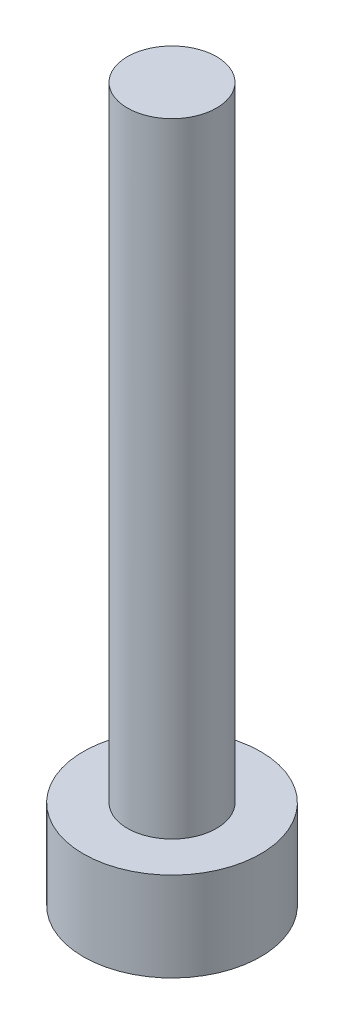
ISO-10303-21;
HEADER;
FILE_DESCRIPTION(('STEP AP214'),'2;1');
FILE_NAME('part.step','',(''),(''),'','','');
FILE_SCHEMA(('AUTOMOTIVE_DESIGN { 1 0 10303 214 1 1 1 1 }'));
ENDSEC;
DATA;
#1=APPLICATION_CONTEXT('core data for automotive mechanical design processes');
#2=APPLICATION_PROTOCOL_DEFINITION('international standard','automotive_design',2000,#1);
#3=PRODUCT_CONTEXT('',#1,'mechanical');
#4=PRODUCT('Part','Part','',(#3));
#5=PRODUCT_RELATED_PRODUCT_CATEGORY('part','',(#4));
#6=PRODUCT_DEFINITION_FORMATION('','',#4);
#7=PRODUCT_DEFINITION_CONTEXT('part definition',#1,'design');
#8=PRODUCT_DEFINITION('design','',#6,#7);
#9=PRODUCT_DEFINITION_SHAPE('','',#8);
#10=(LENGTH_UNIT() NAMED_UNIT(*) SI_UNIT(.MILLI.,.METRE.));
#11=(NAMED_UNIT(*) PLANE_ANGLE_UNIT() SI_UNIT($,.RADIAN.));
#12=(NAMED_UNIT(*) SI_UNIT($,.STERADIAN.) SOLID_ANGLE_UNIT());
#13=UNCERTAINTY_MEASURE_WITH_UNIT(LENGTH_MEASURE(1.E-05),#10,'distance_accuracy_value','');
#14=(GEOMETRIC_REPRESENTATION_CONTEXT(3) GLOBAL_UNCERTAINTY_ASSIGNED_CONTEXT((#13)) GLOBAL_UNIT_ASSIGNED_CONTEXT((#10,
#11,#12)) REPRESENTATION_CONTEXT('',''));
#15=CARTESIAN_POINT('',(0.,0.,0.));
#16=DIRECTION('',(0.,0.,1.));
#17=DIRECTION('',(1.,0.,0.));
#18=AXIS2_PLACEMENT_3D('',#15,#16,#17);
#19=CARTESIAN_POINT('',(0.,14.,0.));
#20=DIRECTION('',(0.,-1.,0.));
#21=DIRECTION('',(0.,0.,-1.));
#22=AXIS2_PLACEMENT_3D('',#19,#20,#21);
#23=CYLINDRICAL_SURFACE('',#22,1.);
#24=CARTESIAN_POINT('',(0.,14.,0.));
#25=DIRECTION('',(0.,1.,0.));
#26=DIRECTION('',(0.,0.,1.));
#27=AXIS2_PLACEMENT_3D('',#24,#25,#26);
#28=CIRCLE('',#27,1.);
#29=CARTESIAN_POINT('',(0.,14.,1.));
#30=VERTEX_POINT('',#29);
#31=EDGE_CURVE('E10',#30,#30,#28,.T.);
#32=ORIENTED_EDGE('',*,*,#31,.F.);
#33=EDGE_LOOP('',(#32));
#34=FACE_BOUND('',#33,.T.);
#35=CARTESIAN_POINT('',(0.,0.,0.));
#36=DIRECTION('',(0.,-1.,0.));
#37=DIRECTION('',(0.,0.,-1.));
#38=AXIS2_PLACEMENT_3D('',#35,#36,#37);
#39=CIRCLE('',#38,1.);
#40=CARTESIAN_POINT('',(0.,0.,-1.));
#41=VERTEX_POINT('',#40);
#42=EDGE_CURVE('E39',#41,#41,#39,.T.);
#43=ORIENTED_EDGE('',*,*,#42,.F.);
#44=EDGE_LOOP('',(#43));
#45=FACE_BOUND('',#44,.T.);
#46=ADVANCED_FACE('F33',(#34,#45),#23,.T.);
#47=CARTESIAN_POINT('',(0.,14.,0.));
#48=DIRECTION('',(0.,1.,0.));
#49=DIRECTION('',(0.,0.,1.));
#50=AXIS2_PLACEMENT_3D('',#47,#48,#49);
#51=PLANE('',#50);
#52=ORIENTED_EDGE('',*,*,#31,.T.);
#53=EDGE_LOOP('',(#52));
#54=FACE_BOUND('',#53,.T.);
#55=ADVANCED_FACE('F66',(#54),#51,.T.);
#56=CARTESIAN_POINT('',(0.,-2.,0.));
#57=DIRECTION('',(0.,1.,0.));
#58=DIRECTION('',(0.,0.,1.));
#59=AXIS2_PLACEMENT_3D('',#56,#57,#58);
#60=CYLINDRICAL_SURFACE('',#59,1.99);
#61=CARTESIAN_POINT('',(0.,-2.,0.));
#62=DIRECTION('',(0.,-1.,0.));
#63=DIRECTION('',(0.,0.,-1.));
#64=AXIS2_PLACEMENT_3D('',#61,#62,#63);
#65=CIRCLE('',#64,1.99);
#66=CARTESIAN_POINT('',(0.,-2.,-1.99));
#67=VERTEX_POINT('',#66);
#68=EDGE_CURVE('E43',#67,#67,#65,.T.);
#69=ORIENTED_EDGE('',*,*,#68,.F.);
#70=EDGE_LOOP('',(#69));
#71=FACE_BOUND('',#70,.T.);
#72=CARTESIAN_POINT('',(0.,0.,0.));
#73=DIRECTION('',(0.,-1.,0.));
#74=DIRECTION('',(0.,0.,-1.));
#75=AXIS2_PLACEMENT_3D('',#72,#73,#74);
#76=CIRCLE('',#75,1.99);
#77=CARTESIAN_POINT('',(0.,0.,-1.99));
#78=VERTEX_POINT('',#77);
#79=EDGE_CURVE('E47',#78,#78,#76,.T.);
#80=ORIENTED_EDGE('',*,*,#79,.T.);
#81=EDGE_LOOP('',(#80));
#82=FACE_BOUND('',#81,.T.);
#83=ADVANCED_FACE('F53',(#71,#82),#60,.T.);
#84=CARTESIAN_POINT('',(0.,-2.,0.));
#85=DIRECTION('',(0.,-1.,0.));
#86=DIRECTION('',(0.,0.,-1.));
#87=AXIS2_PLACEMENT_3D('',#84,#85,#86);
#88=PLANE('',#87);
#89=ORIENTED_EDGE('',*,*,#68,.T.);
#90=EDGE_LOOP('',(#89));
#91=FACE_BOUND('',#90,.T.);
#92=ADVANCED_FACE('F57',(#91),#88,.T.);
#93=CARTESIAN_POINT('',(0.,0.,0.));
#94=DIRECTION('',(0.,-1.,0.));
#95=DIRECTION('',(0.,0.,-1.));
#96=AXIS2_PLACEMENT_3D('',#93,#94,#95);
#97=PLANE('',#96);
#98=ORIENTED_EDGE('',*,*,#42,.T.);
#99=EDGE_LOOP('',(#98));
#100=FACE_BOUND('',#99,.T.);
#101=ORIENTED_EDGE('',*,*,#79,.F.);
#102=EDGE_LOOP('',(#101));
#103=FACE_BOUND('',#102,.T.);
#104=ADVANCED_FACE('F55',(#100,#103),#97,.F.);
#105=CLOSED_SHELL('',(#46,#55,#83,#92,#104));
#106=MANIFOLD_SOLID_BREP('B2',#105);
#107=ADVANCED_BREP_SHAPE_REPRESENTATION('',(#18,#106),#14);
#108=SHAPE_DEFINITION_REPRESENTATION(#9,#107);
ENDSEC;
END-ISO-10303-21;
